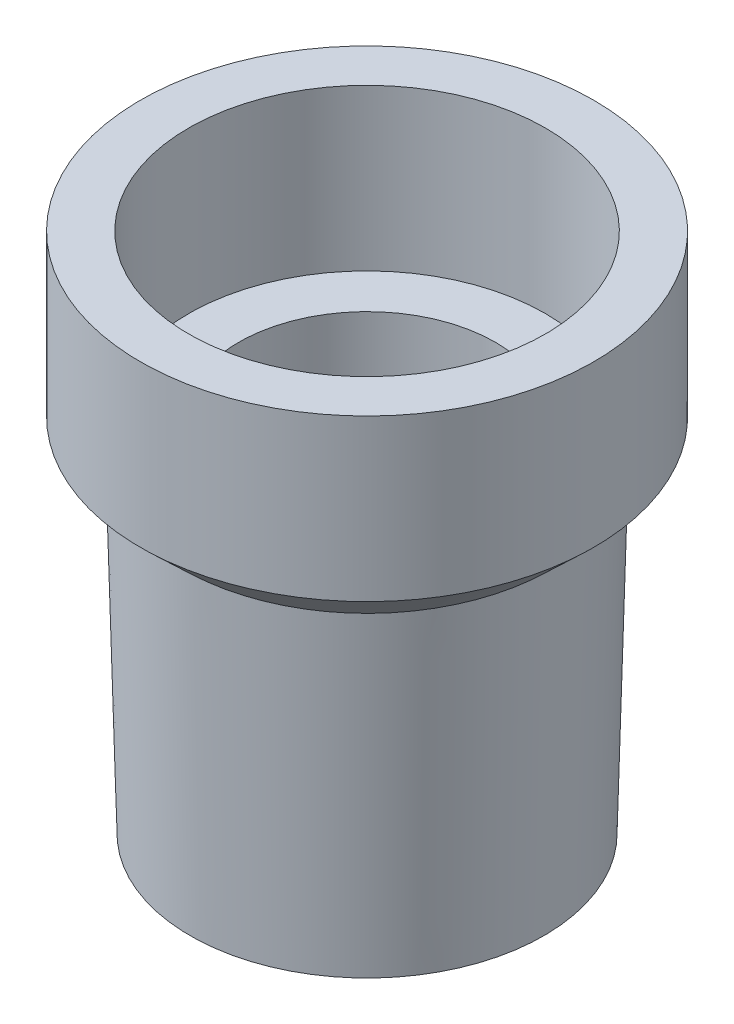
ISO-10303-21;
HEADER;
FILE_DESCRIPTION(('STEP AP214'),'2;1');
FILE_NAME('part.step','',(''),(''),'','','');
FILE_SCHEMA(('AUTOMOTIVE_DESIGN { 1 0 10303 214 1 1 1 1 }'));
ENDSEC;
DATA;
#1=APPLICATION_CONTEXT('core data for automotive mechanical design processes');
#2=APPLICATION_PROTOCOL_DEFINITION('international standard','automotive_design',2000,#1);
#3=PRODUCT_CONTEXT('',#1,'mechanical');
#4=PRODUCT('Part','Part','',(#3));
#5=PRODUCT_RELATED_PRODUCT_CATEGORY('part','',(#4));
#6=PRODUCT_DEFINITION_FORMATION('','',#4);
#7=PRODUCT_DEFINITION_CONTEXT('part definition',#1,'design');
#8=PRODUCT_DEFINITION('design','',#6,#7);
#9=PRODUCT_DEFINITION_SHAPE('','',#8);
#10=(LENGTH_UNIT() NAMED_UNIT(*) SI_UNIT(.MILLI.,.METRE.));
#11=(NAMED_UNIT(*) PLANE_ANGLE_UNIT() SI_UNIT($,.RADIAN.));
#12=(NAMED_UNIT(*) SI_UNIT($,.STERADIAN.) SOLID_ANGLE_UNIT());
#13=UNCERTAINTY_MEASURE_WITH_UNIT(LENGTH_MEASURE(1.E-05),#10,'distance_accuracy_value','');
#14=(GEOMETRIC_REPRESENTATION_CONTEXT(3) GLOBAL_UNCERTAINTY_ASSIGNED_CONTEXT((#13)) GLOBAL_UNIT_ASSIGNED_CONTEXT((#10,
#11,#12)) REPRESENTATION_CONTEXT('',''));
#15=CARTESIAN_POINT('',(0.,0.,0.));
#16=DIRECTION('',(0.,0.,1.));
#17=DIRECTION('',(1.,0.,0.));
#18=AXIS2_PLACEMENT_3D('',#15,#16,#17);
#19=CARTESIAN_POINT('',(0.,0.,0.));
#20=DIRECTION('',(0.,-1.,0.));
#21=DIRECTION('',(0.,0.,-1.));
#22=AXIS2_PLACEMENT_3D('',#19,#20,#21);
#23=CYLINDRICAL_SURFACE('',#22,8.);
#24=CARTESIAN_POINT('',(0.,0.,0.));
#25=DIRECTION('',(0.,-1.,0.));
#26=DIRECTION('',(0.,0.,-1.));
#27=AXIS2_PLACEMENT_3D('',#24,#25,#26);
#28=CIRCLE('',#27,8.);
#29=CARTESIAN_POINT('',(0.,0.,-8.));
#30=VERTEX_POINT('',#29);
#31=EDGE_CURVE('E59',#30,#30,#28,.T.);
#32=ORIENTED_EDGE('',*,*,#31,.T.);
#33=EDGE_LOOP('',(#32));
#34=FACE_BOUND('',#33,.T.);
#35=CARTESIAN_POINT('',(0.,22.4731707317073,0.));
#36=DIRECTION('',(0.,-1.,0.));
#37=DIRECTION('',(0.,0.,-1.));
#38=AXIS2_PLACEMENT_3D('',#35,#36,#37);
#39=CIRCLE('',#38,8.);
#40=CARTESIAN_POINT('',(0.,22.4731707317073,-8.));
#41=VERTEX_POINT('',#40);
#42=EDGE_CURVE('E10',#41,#41,#39,.T.);
#43=ORIENTED_EDGE('',*,*,#42,.F.);
#44=EDGE_LOOP('',(#43));
#45=FACE_BOUND('',#44,.T.);
#46=ADVANCED_FACE('F31',(#34,#45),#23,.F.);
#47=CARTESIAN_POINT('',(11.1,22.4731707317073,0.));
#48=DIRECTION('',(0.,1.,0.));
#49=DIRECTION('',(0.,0.,1.));
#50=AXIS2_PLACEMENT_3D('',#47,#48,#49);
#51=PLANE('',#50);
#52=ORIENTED_EDGE('',*,*,#42,.T.);
#53=EDGE_LOOP('',(#52));
#54=FACE_BOUND('',#53,.T.);
#55=CARTESIAN_POINT('',(0.,22.4731707317073,0.));
#56=DIRECTION('',(0.,-1.,0.));
#57=DIRECTION('',(0.,0.,-1.));
#58=AXIS2_PLACEMENT_3D('',#55,#56,#57);
#59=CIRCLE('',#58,11.1);
#60=CARTESIAN_POINT('',(0.,22.4731707317073,-11.1));
#61=VERTEX_POINT('',#60);
#62=EDGE_CURVE('E37',#61,#61,#59,.T.);
#63=ORIENTED_EDGE('',*,*,#62,.F.);
#64=EDGE_LOOP('',(#63));
#65=FACE_BOUND('',#64,.T.);
#66=ADVANCED_FACE('F77',(#54,#65),#51,.T.);
#67=CARTESIAN_POINT('',(0.,0.,0.));
#68=DIRECTION('',(0.,-1.,0.));
#69=DIRECTION('',(0.,0.,-1.));
#70=AXIS2_PLACEMENT_3D('',#67,#68,#69);
#71=CYLINDRICAL_SURFACE('',#70,11.1);
#72=ORIENTED_EDGE('',*,*,#62,.T.);
#73=EDGE_LOOP('',(#72));
#74=FACE_BOUND('',#73,.T.);
#75=CARTESIAN_POINT('',(0.,32.4731707317073,0.));
#76=DIRECTION('',(0.,-1.,0.));
#77=DIRECTION('',(0.,0.,-1.));
#78=AXIS2_PLACEMENT_3D('',#75,#76,#77);
#79=CIRCLE('',#78,11.1);
#80=CARTESIAN_POINT('',(0.,32.4731707317073,-11.1));
#81=VERTEX_POINT('',#80);
#82=EDGE_CURVE('E41',#81,#81,#79,.T.);
#83=ORIENTED_EDGE('',*,*,#82,.F.);
#84=EDGE_LOOP('',(#83));
#85=FACE_BOUND('',#84,.T.);
#86=ADVANCED_FACE('F81',(#74,#85),#71,.F.);
#87=CARTESIAN_POINT('',(11.1,32.4731707317073,0.));
#88=DIRECTION('',(0.,1.,0.));
#89=DIRECTION('',(0.,0.,1.));
#90=AXIS2_PLACEMENT_3D('',#87,#88,#89);
#91=PLANE('',#90);
#92=ORIENTED_EDGE('',*,*,#82,.T.);
#93=EDGE_LOOP('',(#92));
#94=FACE_BOUND('',#93,.T.);
#95=CARTESIAN_POINT('',(0.,32.4731707317073,0.));
#96=DIRECTION('',(0.,-1.,0.));
#97=DIRECTION('',(0.,0.,-1.));
#98=AXIS2_PLACEMENT_3D('',#95,#96,#97);
#99=CIRCLE('',#98,14.1);
#100=CARTESIAN_POINT('',(0.,32.4731707317073,-14.1));
#101=VERTEX_POINT('',#100);
#102=EDGE_CURVE('E45',#101,#101,#99,.T.);
#103=ORIENTED_EDGE('',*,*,#102,.F.);
#104=EDGE_LOOP('',(#103));
#105=FACE_BOUND('',#104,.T.);
#106=ADVANCED_FACE('F85',(#94,#105),#91,.T.);
#107=CARTESIAN_POINT('',(0.,0.,0.));
#108=DIRECTION('',(0.,-1.,0.));
#109=DIRECTION('',(0.,0.,-1.));
#110=AXIS2_PLACEMENT_3D('',#107,#108,#109);
#111=CYLINDRICAL_SURFACE('',#110,14.1);
#112=ORIENTED_EDGE('',*,*,#102,.T.);
#113=EDGE_LOOP('',(#112));
#114=FACE_BOUND('',#113,.T.);
#115=CARTESIAN_POINT('',(0.,22.4731707317073,0.));
#116=DIRECTION('',(0.,-1.,0.));
#117=DIRECTION('',(0.,0.,-1.));
#118=AXIS2_PLACEMENT_3D('',#115,#116,#117);
#119=CIRCLE('',#118,14.1);
#120=CARTESIAN_POINT('',(0.,22.4731707317073,-14.1));
#121=VERTEX_POINT('',#120);
#122=EDGE_CURVE('E50',#121,#121,#119,.T.);
#123=ORIENTED_EDGE('',*,*,#122,.F.);
#124=EDGE_LOOP('',(#123));
#125=FACE_BOUND('',#124,.T.);
#126=ADVANCED_FACE('F91',(#114,#125),#111,.T.);
#127=CARTESIAN_POINT('',(0.,20.,0.));
#128=DIRECTION('',(0.,1.,0.));
#129=DIRECTION('',(0.,0.,1.));
#130=AXIS2_PLACEMENT_3D('',#127,#128,#129);
#131=CONICAL_SURFACE('',#130,11.5,0.81039295701637);
#132=ORIENTED_EDGE('',*,*,#122,.T.);
#133=EDGE_LOOP('',(#132));
#134=FACE_BOUND('',#133,.T.);
#135=CARTESIAN_POINT('',(0.,20.,0.));
#136=DIRECTION('',(0.,-1.,0.));
#137=DIRECTION('',(0.,0.,-1.));
#138=AXIS2_PLACEMENT_3D('',#135,#136,#137);
#139=CIRCLE('',#138,11.5);
#140=CARTESIAN_POINT('',(0.,20.,-11.5));
#141=VERTEX_POINT('',#140);
#142=EDGE_CURVE('E53',#141,#141,#139,.T.);
#143=ORIENTED_EDGE('',*,*,#142,.F.);
#144=EDGE_LOOP('',(#143));
#145=FACE_BOUND('',#144,.T.);
#146=ADVANCED_FACE('F73',(#134,#145),#131,.T.);
#147=CARTESIAN_POINT('',(0.,0.,0.));
#148=DIRECTION('',(0.,1.,0.));
#149=DIRECTION('',(0.,0.,1.));
#150=AXIS2_PLACEMENT_3D('',#147,#148,#149);
#151=CONICAL_SURFACE('',#150,11.,0.0249947936189202);
#152=ORIENTED_EDGE('',*,*,#142,.T.);
#153=EDGE_LOOP('',(#152));
#154=FACE_BOUND('',#153,.T.);
#155=CARTESIAN_POINT('',(0.,0.,0.));
#156=DIRECTION('',(0.,-1.,0.));
#157=DIRECTION('',(0.,0.,-1.));
#158=AXIS2_PLACEMENT_3D('',#155,#156,#157);
#159=CIRCLE('',#158,11.);
#160=CARTESIAN_POINT('',(0.,0.,-11.));
#161=VERTEX_POINT('',#160);
#162=EDGE_CURVE('E56',#161,#161,#159,.T.);
#163=ORIENTED_EDGE('',*,*,#162,.F.);
#164=EDGE_LOOP('',(#163));
#165=FACE_BOUND('',#164,.T.);
#166=ADVANCED_FACE('F67',(#154,#165),#151,.T.);
#167=CARTESIAN_POINT('',(11.,0.,0.));
#168=DIRECTION('',(0.,-1.,0.));
#169=DIRECTION('',(0.,0.,-1.));
#170=AXIS2_PLACEMENT_3D('',#167,#168,#169);
#171=PLANE('',#170);
#172=ORIENTED_EDGE('',*,*,#162,.T.);
#173=EDGE_LOOP('',(#172));
#174=FACE_BOUND('',#173,.T.);
#175=ORIENTED_EDGE('',*,*,#31,.F.);
#176=EDGE_LOOP('',(#175));
#177=FACE_BOUND('',#176,.T.);
#178=ADVANCED_FACE('F65',(#174,#177),#171,.T.);
#179=CLOSED_SHELL('',(#46,#66,#86,#106,#126,#146,#166,#178));
#180=MANIFOLD_SOLID_BREP('B2',#179);
#181=ADVANCED_BREP_SHAPE_REPRESENTATION('',(#18,#180),#14);
#182=SHAPE_DEFINITION_REPRESENTATION(#9,#181);
ENDSEC;
END-ISO-10303-21;
